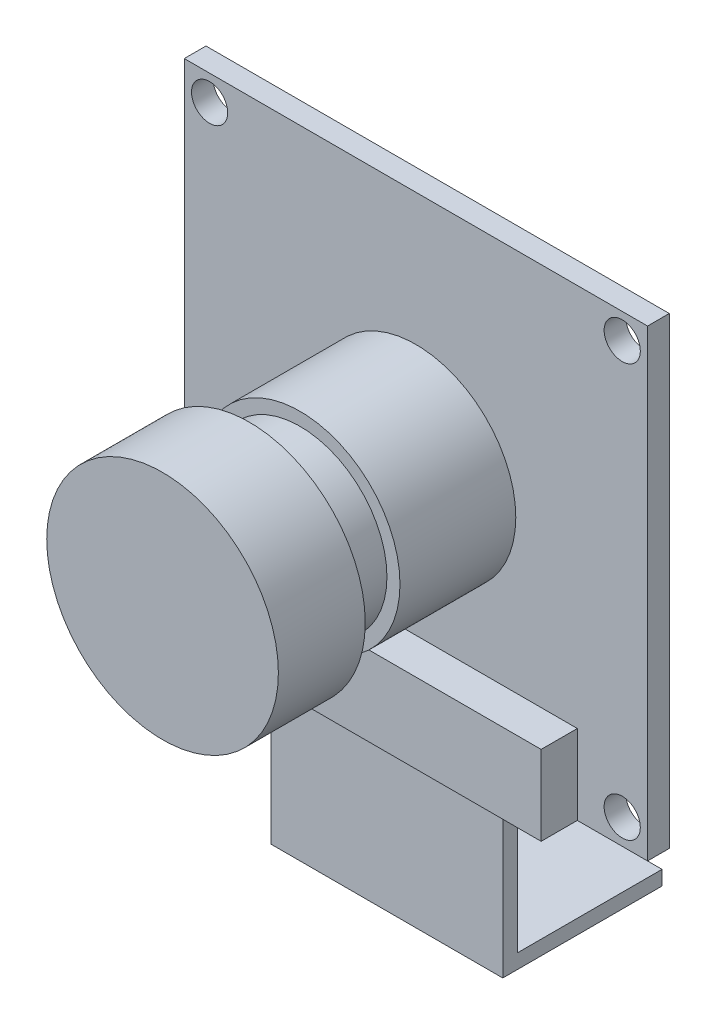
ISO-10303-21;
HEADER;
FILE_DESCRIPTION(('STEP AP214'),'2;1');
FILE_NAME('part.step','',(''),(''),'','','');
FILE_SCHEMA(('AUTOMOTIVE_DESIGN { 1 0 10303 214 1 1 1 1 }'));
ENDSEC;
DATA;
#1=APPLICATION_CONTEXT('core data for automotive mechanical design processes');
#2=APPLICATION_PROTOCOL_DEFINITION('international standard','automotive_design',2000,#1);
#3=PRODUCT_CONTEXT('',#1,'mechanical');
#4=PRODUCT('Part','Part','',(#3));
#5=PRODUCT_RELATED_PRODUCT_CATEGORY('part','',(#4));
#6=PRODUCT_DEFINITION_FORMATION('','',#4);
#7=PRODUCT_DEFINITION_CONTEXT('part definition',#1,'design');
#8=PRODUCT_DEFINITION('design','',#6,#7);
#9=PRODUCT_DEFINITION_SHAPE('','',#8);
#10=(LENGTH_UNIT() NAMED_UNIT(*) SI_UNIT(.MILLI.,.METRE.));
#11=(NAMED_UNIT(*) PLANE_ANGLE_UNIT() SI_UNIT($,.RADIAN.));
#12=(NAMED_UNIT(*) SI_UNIT($,.STERADIAN.) SOLID_ANGLE_UNIT());
#13=UNCERTAINTY_MEASURE_WITH_UNIT(LENGTH_MEASURE(1.E-05),#10,'distance_accuracy_value','');
#14=(GEOMETRIC_REPRESENTATION_CONTEXT(3) GLOBAL_UNCERTAINTY_ASSIGNED_CONTEXT((#13)) GLOBAL_UNIT_ASSIGNED_CONTEXT((#10,
#11,#12)) REPRESENTATION_CONTEXT('',''));
#15=CARTESIAN_POINT('',(0.,0.,0.));
#16=DIRECTION('',(0.,0.,1.));
#17=DIRECTION('',(1.,0.,0.));
#18=AXIS2_PLACEMENT_3D('',#15,#16,#17);
#19=CARTESIAN_POINT('',(0.,0.,1.5));
#20=DIRECTION('',(0.,0.,1.));
#21=DIRECTION('',(1.,0.,0.));
#22=AXIS2_PLACEMENT_3D('',#19,#20,#21);
#23=PLANE('',#22);
#24=CARTESIAN_POINT('',(0.,0.,1.5));
#25=DIRECTION('',(0.,0.,1.));
#26=DIRECTION('',(1.,0.,0.));
#27=AXIS2_PLACEMENT_3D('',#24,#25,#26);
#28=CIRCLE('',#27,6.9);
#29=CARTESIAN_POINT('',(6.9,0.,1.5));
#30=VERTEX_POINT('',#29);
#31=EDGE_CURVE('E228',#30,#30,#28,.T.);
#32=ORIENTED_EDGE('',*,*,#31,.F.);
#33=EDGE_LOOP('',(#32));
#34=FACE_BOUND('',#33,.T.);
#35=CARTESIAN_POINT('',(-14.25,14.25,1.5));
#36=DIRECTION('',(0.,0.,1.));
#37=DIRECTION('',(1.,0.,0.));
#38=AXIS2_PLACEMENT_3D('',#35,#36,#37);
#39=CIRCLE('',#38,1.2500000000001);
#40=CARTESIAN_POINT('',(-12.9999999999999,14.25,1.5));
#41=VERTEX_POINT('',#40);
#42=EDGE_CURVE('E281',#41,#41,#39,.T.);
#43=ORIENTED_EDGE('',*,*,#42,.F.);
#44=EDGE_LOOP('',(#43));
#45=FACE_BOUND('',#44,.T.);
#46=CARTESIAN_POINT('',(-14.25,-14.25,1.5));
#47=DIRECTION('',(0.,0.,1.));
#48=DIRECTION('',(1.,0.,0.));
#49=AXIS2_PLACEMENT_3D('',#46,#47,#48);
#50=CIRCLE('',#49,1.25000000000007);
#51=CARTESIAN_POINT('',(-12.9999999999999,-14.25,1.5));
#52=VERTEX_POINT('',#51);
#53=EDGE_CURVE('E284',#52,#52,#50,.T.);
#54=ORIENTED_EDGE('',*,*,#53,.F.);
#55=EDGE_LOOP('',(#54));
#56=FACE_BOUND('',#55,.T.);
#57=CARTESIAN_POINT('',(14.25,-14.25,1.5));
#58=DIRECTION('',(0.,0.,1.));
#59=DIRECTION('',(1.,0.,0.));
#60=AXIS2_PLACEMENT_3D('',#57,#58,#59);
#61=CIRCLE('',#60,1.25000000000003);
#62=CARTESIAN_POINT('',(15.5,-14.25,1.5));
#63=VERTEX_POINT('',#62);
#64=EDGE_CURVE('E287',#63,#63,#61,.T.);
#65=ORIENTED_EDGE('',*,*,#64,.F.);
#66=EDGE_LOOP('',(#65));
#67=FACE_BOUND('',#66,.T.);
#68=CARTESIAN_POINT('',(14.25,14.25,1.5));
#69=DIRECTION('',(0.,0.,1.));
#70=DIRECTION('',(1.,0.,0.));
#71=AXIS2_PLACEMENT_3D('',#68,#69,#70);
#72=CIRCLE('',#71,1.25);
#73=CARTESIAN_POINT('',(15.5,14.25,1.5));
#74=VERTEX_POINT('',#73);
#75=EDGE_CURVE('E290',#74,#74,#72,.T.);
#76=ORIENTED_EDGE('',*,*,#75,.F.);
#77=EDGE_LOOP('',(#76));
#78=FACE_BOUND('',#77,.T.);
#79=DIRECTION('',(1.,0.,0.));
#80=VECTOR('',#79,1.);
#81=CARTESIAN_POINT('',(0.,-16.,1.5));
#82=LINE('',#81,#80);
#83=CARTESIAN_POINT('',(-16.,-16.,1.5));
#84=VERTEX_POINT('',#83);
#85=CARTESIAN_POINT('',(-11.15,-16.,1.5));
#86=VERTEX_POINT('',#85);
#87=EDGE_CURVE('E273',#84,#86,#82,.T.);
#88=ORIENTED_EDGE('',*,*,#87,.T.);
#89=DIRECTION('',(0.,1.,0.));
#90=VECTOR('',#89,1.);
#91=CARTESIAN_POINT('',(-11.15,0.,1.5));
#92=LINE('',#91,#90);
#93=CARTESIAN_POINT('',(-11.15,-10.5,1.5));
#94=VERTEX_POINT('',#93);
#95=EDGE_CURVE('E235',#86,#94,#92,.T.);
#96=ORIENTED_EDGE('',*,*,#95,.T.);
#97=DIRECTION('',(-1.,0.,0.));
#98=VECTOR('',#97,1.);
#99=CARTESIAN_POINT('',(0.,-10.5,1.5));
#100=LINE('',#99,#98);
#101=CARTESIAN_POINT('',(11.15,-10.5,1.5));
#102=VERTEX_POINT('',#101);
#103=EDGE_CURVE('E251',#102,#94,#100,.T.);
#104=ORIENTED_EDGE('',*,*,#103,.F.);
#105=DIRECTION('',(0.,1.,0.));
#106=VECTOR('',#105,1.);
#107=CARTESIAN_POINT('',(11.15,0.,1.5));
#108=LINE('',#107,#106);
#109=CARTESIAN_POINT('',(11.15,-16.,1.5));
#110=VERTEX_POINT('',#109);
#111=EDGE_CURVE('E242',#110,#102,#108,.T.);
#112=ORIENTED_EDGE('',*,*,#111,.F.);
#113=CARTESIAN_POINT('',(16.,-16.,1.5));
#114=VERTEX_POINT('',#113);
#115=EDGE_CURVE('E271',#110,#114,#82,.T.);
#116=ORIENTED_EDGE('',*,*,#115,.T.);
#117=DIRECTION('',(0.,-1.,0.));
#118=VECTOR('',#117,1.);
#119=CARTESIAN_POINT('',(16.,0.,1.5));
#120=LINE('',#119,#118);
#121=CARTESIAN_POINT('',(16.,16.,1.5));
#122=VERTEX_POINT('',#121);
#123=EDGE_CURVE('E275',#122,#114,#120,.T.);
#124=ORIENTED_EDGE('',*,*,#123,.F.);
#125=DIRECTION('',(1.,0.,0.));
#126=VECTOR('',#125,1.);
#127=CARTESIAN_POINT('',(0.,16.,1.5));
#128=LINE('',#127,#126);
#129=CARTESIAN_POINT('',(-16.,16.,1.5));
#130=VERTEX_POINT('',#129);
#131=EDGE_CURVE('E278',#130,#122,#128,.T.);
#132=ORIENTED_EDGE('',*,*,#131,.F.);
#133=DIRECTION('',(0.,-1.,0.));
#134=VECTOR('',#133,1.);
#135=CARTESIAN_POINT('',(-16.,0.,1.5));
#136=LINE('',#135,#134);
#137=EDGE_CURVE('E268',#130,#84,#136,.T.);
#138=ORIENTED_EDGE('',*,*,#137,.T.);
#139=EDGE_LOOP('',(#88,#96,#104,#112,#116,#124,#132,#138));
#140=FACE_BOUND('',#139,.T.);
#141=ADVANCED_FACE('F55',(#34,#45,#56,#67,#78,#140),#23,.T.);
#142=CARTESIAN_POINT('',(14.25,14.25,1.5));
#143=DIRECTION('',(0.,0.,-1.));
#144=DIRECTION('',(-1.,0.,0.));
#145=AXIS2_PLACEMENT_3D('',#142,#143,#144);
#146=CYLINDRICAL_SURFACE('',#145,1.25);
#147=ORIENTED_EDGE('',*,*,#75,.T.);
#148=EDGE_LOOP('',(#147));
#149=FACE_BOUND('',#148,.T.);
#150=CARTESIAN_POINT('',(14.25,14.25,0.));
#151=DIRECTION('',(0.,0.,1.));
#152=DIRECTION('',(1.,0.,0.));
#153=AXIS2_PLACEMENT_3D('',#150,#151,#152);
#154=CIRCLE('',#153,1.25);
#155=CARTESIAN_POINT('',(15.5,14.25,0.));
#156=VERTEX_POINT('',#155);
#157=EDGE_CURVE('E272',#156,#156,#154,.T.);
#158=ORIENTED_EDGE('',*,*,#157,.F.);
#159=EDGE_LOOP('',(#158));
#160=FACE_BOUND('',#159,.T.);
#161=ADVANCED_FACE('F367',(#149,#160),#146,.F.);
#162=CARTESIAN_POINT('',(14.25,-14.25,1.5));
#163=DIRECTION('',(0.,0.,-1.));
#164=DIRECTION('',(-1.,0.,0.));
#165=AXIS2_PLACEMENT_3D('',#162,#163,#164);
#166=CYLINDRICAL_SURFACE('',#165,1.25000000000003);
#167=ORIENTED_EDGE('',*,*,#64,.T.);
#168=EDGE_LOOP('',(#167));
#169=FACE_BOUND('',#168,.T.);
#170=CARTESIAN_POINT('',(14.25,-14.25,0.));
#171=DIRECTION('',(0.,0.,1.));
#172=DIRECTION('',(1.,0.,0.));
#173=AXIS2_PLACEMENT_3D('',#170,#171,#172);
#174=CIRCLE('',#173,1.25000000000003);
#175=CARTESIAN_POINT('',(15.5,-14.25,0.));
#176=VERTEX_POINT('',#175);
#177=EDGE_CURVE('E311',#176,#176,#174,.T.);
#178=ORIENTED_EDGE('',*,*,#177,.F.);
#179=EDGE_LOOP('',(#178));
#180=FACE_BOUND('',#179,.T.);
#181=ADVANCED_FACE('F373',(#169,#180),#166,.F.);
#182=CARTESIAN_POINT('',(-14.25,-14.25,1.5));
#183=DIRECTION('',(0.,0.,-1.));
#184=DIRECTION('',(-1.,0.,0.));
#185=AXIS2_PLACEMENT_3D('',#182,#183,#184);
#186=CYLINDRICAL_SURFACE('',#185,1.25000000000007);
#187=ORIENTED_EDGE('',*,*,#53,.T.);
#188=EDGE_LOOP('',(#187));
#189=FACE_BOUND('',#188,.T.);
#190=CARTESIAN_POINT('',(-14.25,-14.25,0.));
#191=DIRECTION('',(0.,0.,1.));
#192=DIRECTION('',(1.,0.,0.));
#193=AXIS2_PLACEMENT_3D('',#190,#191,#192);
#194=CIRCLE('',#193,1.25000000000007);
#195=CARTESIAN_POINT('',(-12.9999999999999,-14.25,0.));
#196=VERTEX_POINT('',#195);
#197=EDGE_CURVE('E308',#196,#196,#194,.T.);
#198=ORIENTED_EDGE('',*,*,#197,.F.);
#199=EDGE_LOOP('',(#198));
#200=FACE_BOUND('',#199,.T.);
#201=ADVANCED_FACE('F384',(#189,#200),#186,.F.);
#202=CARTESIAN_POINT('',(-14.25,14.25,1.5));
#203=DIRECTION('',(0.,0.,-1.));
#204=DIRECTION('',(-1.,0.,0.));
#205=AXIS2_PLACEMENT_3D('',#202,#203,#204);
#206=CYLINDRICAL_SURFACE('',#205,1.2500000000001);
#207=ORIENTED_EDGE('',*,*,#42,.T.);
#208=EDGE_LOOP('',(#207));
#209=FACE_BOUND('',#208,.T.);
#210=CARTESIAN_POINT('',(-14.25,14.25,0.));
#211=DIRECTION('',(0.,0.,1.));
#212=DIRECTION('',(1.,0.,0.));
#213=AXIS2_PLACEMENT_3D('',#210,#211,#212);
#214=CIRCLE('',#213,1.2500000000001);
#215=CARTESIAN_POINT('',(-12.9999999999999,14.25,0.));
#216=VERTEX_POINT('',#215);
#217=EDGE_CURVE('E305',#216,#216,#214,.T.);
#218=ORIENTED_EDGE('',*,*,#217,.F.);
#219=EDGE_LOOP('',(#218));
#220=FACE_BOUND('',#219,.T.);
#221=ADVANCED_FACE('F388',(#209,#220),#206,.F.);
#222=CARTESIAN_POINT('',(0.,-16.,1.5));
#223=DIRECTION('',(0.,1.,0.));
#224=DIRECTION('',(0.,0.,1.));
#225=AXIS2_PLACEMENT_3D('',#222,#223,#224);
#226=PLANE('',#225);
#227=DIRECTION('',(1.,0.,0.));
#228=VECTOR('',#227,1.);
#229=CARTESIAN_POINT('',(0.,-16.,3.5));
#230=LINE('',#229,#228);
#231=CARTESIAN_POINT('',(-8.,-16.,3.5));
#232=VERTEX_POINT('',#231);
#233=CARTESIAN_POINT('',(8.,-16.,3.5));
#234=VERTEX_POINT('',#233);
#235=EDGE_CURVE('E70',#232,#234,#230,.T.);
#236=ORIENTED_EDGE('',*,*,#235,.T.);
#237=DIRECTION('',(0.,0.,-1.));
#238=VECTOR('',#237,1.);
#239=CARTESIAN_POINT('',(8.,-16.,0.));
#240=LINE('',#239,#238);
#241=CARTESIAN_POINT('',(8.,-16.,2.5));
#242=VERTEX_POINT('',#241);
#243=EDGE_CURVE('E166',#234,#242,#240,.T.);
#244=ORIENTED_EDGE('',*,*,#243,.T.);
#245=DIRECTION('',(1.,0.,0.));
#246=VECTOR('',#245,1.);
#247=CARTESIAN_POINT('',(0.,-16.,2.5));
#248=LINE('',#247,#246);
#249=CARTESIAN_POINT('',(-8.,-16.,2.5));
#250=VERTEX_POINT('',#249);
#251=EDGE_CURVE('E192',#250,#242,#248,.T.);
#252=ORIENTED_EDGE('',*,*,#251,.F.);
#253=DIRECTION('',(0.,0.,-1.));
#254=VECTOR('',#253,1.);
#255=CARTESIAN_POINT('',(-8.,-16.,0.));
#256=LINE('',#255,#254);
#257=EDGE_CURVE('E75',#232,#250,#256,.T.);
#258=ORIENTED_EDGE('',*,*,#257,.F.);
#259=EDGE_LOOP('',(#236,#244,#252,#258));
#260=FACE_BOUND('',#259,.T.);
#261=DIRECTION('',(1.,0.,0.));
#262=VECTOR('',#261,1.);
#263=CARTESIAN_POINT('',(0.,-16.,0.));
#264=LINE('',#263,#262);
#265=CARTESIAN_POINT('',(-16.,-16.,0.));
#266=VERTEX_POINT('',#265);
#267=CARTESIAN_POINT('',(16.,-16.,0.));
#268=VERTEX_POINT('',#267);
#269=EDGE_CURVE('E296',#266,#268,#264,.T.);
#270=ORIENTED_EDGE('',*,*,#269,.T.);
#271=DIRECTION('',(0.,0.,-1.));
#272=VECTOR('',#271,1.);
#273=CARTESIAN_POINT('',(16.,-16.,1.5));
#274=LINE('',#273,#272);
#275=EDGE_CURVE('E319',#114,#268,#274,.T.);
#276=ORIENTED_EDGE('',*,*,#275,.F.);
#277=ORIENTED_EDGE('',*,*,#115,.F.);
#278=DIRECTION('',(0.,0.,-1.));
#279=VECTOR('',#278,1.);
#280=CARTESIAN_POINT('',(11.15,-16.,4.));
#281=LINE('',#280,#279);
#282=CARTESIAN_POINT('',(11.15,-16.,4.));
#283=VERTEX_POINT('',#282);
#284=EDGE_CURVE('E260',#283,#110,#281,.T.);
#285=ORIENTED_EDGE('',*,*,#284,.F.);
#286=DIRECTION('',(-1.,0.,0.));
#287=VECTOR('',#286,1.);
#288=CARTESIAN_POINT('',(0.,-16.,4.));
#289=LINE('',#288,#287);
#290=CARTESIAN_POINT('',(-11.15,-16.,4.));
#291=VERTEX_POINT('',#290);
#292=EDGE_CURVE('E246',#283,#291,#289,.T.);
#293=ORIENTED_EDGE('',*,*,#292,.T.);
#294=DIRECTION('',(0.,0.,-1.));
#295=VECTOR('',#294,1.);
#296=CARTESIAN_POINT('',(-11.15,-16.,4.));
#297=LINE('',#296,#295);
#298=EDGE_CURVE('E256',#291,#86,#297,.T.);
#299=ORIENTED_EDGE('',*,*,#298,.T.);
#300=ORIENTED_EDGE('',*,*,#87,.F.);
#301=DIRECTION('',(0.,0.,-1.));
#302=VECTOR('',#301,1.);
#303=CARTESIAN_POINT('',(-16.,-16.,1.5));
#304=LINE('',#303,#302);
#305=EDGE_CURVE('E231',#84,#266,#304,.T.);
#306=ORIENTED_EDGE('',*,*,#305,.T.);
#307=EDGE_LOOP('',(#270,#276,#277,#285,#293,#299,#300,#306));
#308=FACE_BOUND('',#307,.T.);
#309=ADVANCED_FACE('F323',(#260,#308),#226,.F.);
#310=CARTESIAN_POINT('',(16.,0.,1.5));
#311=DIRECTION('',(1.,0.,0.));
#312=DIRECTION('',(0.,0.,-1.));
#313=AXIS2_PLACEMENT_3D('',#310,#311,#312);
#314=PLANE('',#313);
#315=DIRECTION('',(0.,-1.,0.));
#316=VECTOR('',#315,1.);
#317=CARTESIAN_POINT('',(16.,0.,0.));
#318=LINE('',#317,#316);
#319=CARTESIAN_POINT('',(16.,16.,0.));
#320=VERTEX_POINT('',#319);
#321=EDGE_CURVE('E299',#320,#268,#318,.T.);
#322=ORIENTED_EDGE('',*,*,#321,.F.);
#323=DIRECTION('',(0.,0.,-1.));
#324=VECTOR('',#323,1.);
#325=CARTESIAN_POINT('',(16.,16.,1.5));
#326=LINE('',#325,#324);
#327=EDGE_CURVE('E317',#122,#320,#326,.T.);
#328=ORIENTED_EDGE('',*,*,#327,.F.);
#329=ORIENTED_EDGE('',*,*,#123,.T.);
#330=ORIENTED_EDGE('',*,*,#275,.T.);
#331=EDGE_LOOP('',(#322,#328,#329,#330));
#332=FACE_BOUND('',#331,.T.);
#333=ADVANCED_FACE('F338',(#332),#314,.T.);
#334=CARTESIAN_POINT('',(0.,16.,1.5));
#335=DIRECTION('',(0.,1.,0.));
#336=DIRECTION('',(0.,0.,1.));
#337=AXIS2_PLACEMENT_3D('',#334,#335,#336);
#338=PLANE('',#337);
#339=DIRECTION('',(1.,0.,0.));
#340=VECTOR('',#339,1.);
#341=CARTESIAN_POINT('',(0.,16.,0.));
#342=LINE('',#341,#340);
#343=CARTESIAN_POINT('',(-16.,16.,0.));
#344=VERTEX_POINT('',#343);
#345=EDGE_CURVE('E302',#344,#320,#342,.T.);
#346=ORIENTED_EDGE('',*,*,#345,.F.);
#347=DIRECTION('',(0.,0.,-1.));
#348=VECTOR('',#347,1.);
#349=CARTESIAN_POINT('',(-16.,16.,1.5));
#350=LINE('',#349,#348);
#351=EDGE_CURVE('E293',#130,#344,#350,.T.);
#352=ORIENTED_EDGE('',*,*,#351,.F.);
#353=ORIENTED_EDGE('',*,*,#131,.T.);
#354=ORIENTED_EDGE('',*,*,#327,.T.);
#355=EDGE_LOOP('',(#346,#352,#353,#354));
#356=FACE_BOUND('',#355,.T.);
#357=ADVANCED_FACE('F333',(#356),#338,.T.);
#358=CARTESIAN_POINT('',(-16.,0.,1.5));
#359=DIRECTION('',(1.,0.,0.));
#360=DIRECTION('',(0.,0.,-1.));
#361=AXIS2_PLACEMENT_3D('',#358,#359,#360);
#362=PLANE('',#361);
#363=DIRECTION('',(0.,-1.,0.));
#364=VECTOR('',#363,1.);
#365=CARTESIAN_POINT('',(-16.,0.,0.));
#366=LINE('',#365,#364);
#367=EDGE_CURVE('E259',#344,#266,#366,.T.);
#368=ORIENTED_EDGE('',*,*,#367,.T.);
#369=ORIENTED_EDGE('',*,*,#305,.F.);
#370=ORIENTED_EDGE('',*,*,#137,.F.);
#371=ORIENTED_EDGE('',*,*,#351,.T.);
#372=EDGE_LOOP('',(#368,#369,#370,#371));
#373=FACE_BOUND('',#372,.T.);
#374=ADVANCED_FACE('F57',(#373),#362,.F.);
#375=CARTESIAN_POINT('',(0.,0.,0.));
#376=DIRECTION('',(0.,0.,1.));
#377=DIRECTION('',(1.,0.,0.));
#378=AXIS2_PLACEMENT_3D('',#375,#376,#377);
#379=PLANE('',#378);
#380=CARTESIAN_POINT('',(-9.50000000000001,0.,0.));
#381=DIRECTION('',(0.,0.,1.));
#382=DIRECTION('',(1.,0.,0.));
#383=AXIS2_PLACEMENT_3D('',#380,#381,#382);
#384=CIRCLE('',#383,1.5);
#385=CARTESIAN_POINT('',(-8.00000000000001,0.,0.));
#386=VERTEX_POINT('',#385);
#387=EDGE_CURVE('E12',#386,#386,#384,.F.);
#388=ORIENTED_EDGE('',*,*,#387,.F.);
#389=EDGE_LOOP('',(#388));
#390=FACE_BOUND('',#389,.T.);
#391=CARTESIAN_POINT('',(9.50000000000001,0.,0.));
#392=DIRECTION('',(0.,0.,1.));
#393=DIRECTION('',(1.,0.,0.));
#394=AXIS2_PLACEMENT_3D('',#391,#392,#393);
#395=CIRCLE('',#394,1.5);
#396=CARTESIAN_POINT('',(11.,0.,0.));
#397=VERTEX_POINT('',#396);
#398=EDGE_CURVE('E213',#397,#397,#395,.T.);
#399=ORIENTED_EDGE('',*,*,#398,.T.);
#400=EDGE_LOOP('',(#399));
#401=FACE_BOUND('',#400,.T.);
#402=ORIENTED_EDGE('',*,*,#367,.F.);
#403=ORIENTED_EDGE('',*,*,#345,.T.);
#404=ORIENTED_EDGE('',*,*,#321,.T.);
#405=ORIENTED_EDGE('',*,*,#269,.F.);
#406=EDGE_LOOP('',(#402,#403,#404,#405));
#407=FACE_BOUND('',#406,.T.);
#408=ORIENTED_EDGE('',*,*,#217,.T.);
#409=EDGE_LOOP('',(#408));
#410=FACE_BOUND('',#409,.T.);
#411=ORIENTED_EDGE('',*,*,#197,.T.);
#412=EDGE_LOOP('',(#411));
#413=FACE_BOUND('',#412,.T.);
#414=ORIENTED_EDGE('',*,*,#177,.T.);
#415=EDGE_LOOP('',(#414));
#416=FACE_BOUND('',#415,.T.);
#417=ORIENTED_EDGE('',*,*,#157,.T.);
#418=EDGE_LOOP('',(#417));
#419=FACE_BOUND('',#418,.T.);
#420=ADVANCED_FACE('F330',(#390,#401,#407,#410,#413,#416,#419),#379,.F.);
#421=CARTESIAN_POINT('',(-11.15,0.,4.));
#422=DIRECTION('',(-1.,0.,0.));
#423=DIRECTION('',(0.,0.,1.));
#424=AXIS2_PLACEMENT_3D('',#421,#422,#423);
#425=PLANE('',#424);
#426=ORIENTED_EDGE('',*,*,#95,.F.);
#427=ORIENTED_EDGE('',*,*,#298,.F.);
#428=DIRECTION('',(0.,1.,0.));
#429=VECTOR('',#428,1.);
#430=CARTESIAN_POINT('',(-11.15,0.,4.));
#431=LINE('',#430,#429);
#432=CARTESIAN_POINT('',(-11.15,-10.5,4.));
#433=VERTEX_POINT('',#432);
#434=EDGE_CURVE('E238',#291,#433,#431,.T.);
#435=ORIENTED_EDGE('',*,*,#434,.T.);
#436=DIRECTION('',(0.,0.,-1.));
#437=VECTOR('',#436,1.);
#438=CARTESIAN_POINT('',(-11.15,-10.5,4.));
#439=LINE('',#438,#437);
#440=EDGE_CURVE('E249',#433,#94,#439,.T.);
#441=ORIENTED_EDGE('',*,*,#440,.T.);
#442=EDGE_LOOP('',(#426,#427,#435,#441));
#443=FACE_BOUND('',#442,.T.);
#444=ADVANCED_FACE('F352',(#443),#425,.T.);
#445=CARTESIAN_POINT('',(11.15,0.,4.));
#446=DIRECTION('',(-1.,0.,0.));
#447=DIRECTION('',(0.,0.,1.));
#448=AXIS2_PLACEMENT_3D('',#445,#446,#447);
#449=PLANE('',#448);
#450=ORIENTED_EDGE('',*,*,#111,.T.);
#451=DIRECTION('',(0.,0.,-1.));
#452=VECTOR('',#451,1.);
#453=CARTESIAN_POINT('',(11.15,-10.5,4.));
#454=LINE('',#453,#452);
#455=CARTESIAN_POINT('',(11.15,-10.5,4.));
#456=VERTEX_POINT('',#455);
#457=EDGE_CURVE('E263',#456,#102,#454,.T.);
#458=ORIENTED_EDGE('',*,*,#457,.F.);
#459=DIRECTION('',(0.,1.,0.));
#460=VECTOR('',#459,1.);
#461=CARTESIAN_POINT('',(11.15,0.,4.));
#462=LINE('',#461,#460);
#463=EDGE_CURVE('E244',#283,#456,#462,.T.);
#464=ORIENTED_EDGE('',*,*,#463,.F.);
#465=ORIENTED_EDGE('',*,*,#284,.T.);
#466=EDGE_LOOP('',(#450,#458,#464,#465));
#467=FACE_BOUND('',#466,.T.);
#468=ADVANCED_FACE('F343',(#467),#449,.F.);
#469=CARTESIAN_POINT('',(0.,-10.5,4.));
#470=DIRECTION('',(0.,-1.,0.));
#471=DIRECTION('',(0.,0.,-1.));
#472=AXIS2_PLACEMENT_3D('',#469,#470,#471);
#473=PLANE('',#472);
#474=ORIENTED_EDGE('',*,*,#103,.T.);
#475=ORIENTED_EDGE('',*,*,#440,.F.);
#476=DIRECTION('',(-1.,0.,0.));
#477=VECTOR('',#476,1.);
#478=CARTESIAN_POINT('',(0.,-10.5,4.));
#479=LINE('',#478,#477);
#480=EDGE_CURVE('E241',#456,#433,#479,.T.);
#481=ORIENTED_EDGE('',*,*,#480,.F.);
#482=ORIENTED_EDGE('',*,*,#457,.T.);
#483=EDGE_LOOP('',(#474,#475,#481,#482));
#484=FACE_BOUND('',#483,.T.);
#485=ADVANCED_FACE('F355',(#484),#473,.F.);
#486=CARTESIAN_POINT('',(0.,0.,4.));
#487=DIRECTION('',(0.,0.,1.));
#488=DIRECTION('',(1.,0.,0.));
#489=AXIS2_PLACEMENT_3D('',#486,#487,#488);
#490=PLANE('',#489);
#491=ORIENTED_EDGE('',*,*,#434,.F.);
#492=ORIENTED_EDGE('',*,*,#292,.F.);
#493=ORIENTED_EDGE('',*,*,#463,.T.);
#494=ORIENTED_EDGE('',*,*,#480,.T.);
#495=EDGE_LOOP('',(#491,#492,#493,#494));
#496=FACE_BOUND('',#495,.T.);
#497=ADVANCED_FACE('F349',(#496),#490,.T.);
#498=CARTESIAN_POINT('',(0.,0.,9.5));
#499=DIRECTION('',(0.,0.,-1.));
#500=DIRECTION('',(-1.,0.,0.));
#501=AXIS2_PLACEMENT_3D('',#498,#499,#500);
#502=CYLINDRICAL_SURFACE('',#501,6.9);
#503=CARTESIAN_POINT('',(0.,0.,9.5));
#504=DIRECTION('',(0.,0.,1.));
#505=DIRECTION('',(1.,0.,0.));
#506=AXIS2_PLACEMENT_3D('',#503,#504,#505);
#507=CIRCLE('',#506,6.9);
#508=CARTESIAN_POINT('',(6.9,0.,9.5));
#509=VERTEX_POINT('',#508);
#510=EDGE_CURVE('E232',#509,#509,#507,.T.);
#511=ORIENTED_EDGE('',*,*,#510,.F.);
#512=EDGE_LOOP('',(#511));
#513=FACE_BOUND('',#512,.T.);
#514=ORIENTED_EDGE('',*,*,#31,.T.);
#515=EDGE_LOOP('',(#514));
#516=FACE_BOUND('',#515,.T.);
#517=ADVANCED_FACE('F362',(#513,#516),#502,.T.);
#518=CARTESIAN_POINT('',(0.,0.,9.5));
#519=DIRECTION('',(0.,0.,1.));
#520=DIRECTION('',(1.,0.,0.));
#521=AXIS2_PLACEMENT_3D('',#518,#519,#520);
#522=PLANE('',#521);
#523=CARTESIAN_POINT('',(0.,0.,9.5));
#524=DIRECTION('',(0.,0.,1.));
#525=DIRECTION('',(1.,0.,0.));
#526=AXIS2_PLACEMENT_3D('',#523,#524,#525);
#527=CIRCLE('',#526,6.);
#528=CARTESIAN_POINT('',(6.,0.,9.5));
#529=VERTEX_POINT('',#528);
#530=EDGE_CURVE('E63',#529,#529,#527,.T.);
#531=ORIENTED_EDGE('',*,*,#530,.F.);
#532=EDGE_LOOP('',(#531));
#533=FACE_BOUND('',#532,.T.);
#534=ORIENTED_EDGE('',*,*,#510,.T.);
#535=EDGE_LOOP('',(#534));
#536=FACE_BOUND('',#535,.T.);
#537=ADVANCED_FACE('F459',(#533,#536),#522,.T.);
#538=CARTESIAN_POINT('',(0.,0.,13.));
#539=DIRECTION('',(0.,0.,-1.));
#540=DIRECTION('',(-1.,0.,0.));
#541=AXIS2_PLACEMENT_3D('',#538,#539,#540);
#542=CYLINDRICAL_SURFACE('',#541,6.);
#543=CARTESIAN_POINT('',(0.,0.,13.));
#544=DIRECTION('',(0.,0.,1.));
#545=DIRECTION('',(1.,0.,0.));
#546=AXIS2_PLACEMENT_3D('',#543,#544,#545);
#547=CIRCLE('',#546,6.);
#548=CARTESIAN_POINT('',(6.,0.,13.));
#549=VERTEX_POINT('',#548);
#550=EDGE_CURVE('E223',#549,#549,#547,.T.);
#551=ORIENTED_EDGE('',*,*,#550,.F.);
#552=EDGE_LOOP('',(#551));
#553=FACE_BOUND('',#552,.T.);
#554=ORIENTED_EDGE('',*,*,#530,.T.);
#555=EDGE_LOOP('',(#554));
#556=FACE_BOUND('',#555,.T.);
#557=ADVANCED_FACE('F470',(#553,#556),#542,.T.);
#558=CARTESIAN_POINT('',(0.,0.,19.));
#559=DIRECTION('',(0.,0.,-1.));
#560=DIRECTION('',(-1.,0.,0.));
#561=AXIS2_PLACEMENT_3D('',#558,#559,#560);
#562=CYLINDRICAL_SURFACE('',#561,8.);
#563=CARTESIAN_POINT('',(0.,0.,19.));
#564=DIRECTION('',(0.,0.,1.));
#565=DIRECTION('',(1.,0.,0.));
#566=AXIS2_PLACEMENT_3D('',#563,#564,#565);
#567=CIRCLE('',#566,8.);
#568=CARTESIAN_POINT('',(7.99999999999999,0.,19.));
#569=VERTEX_POINT('',#568);
#570=EDGE_CURVE('E220',#569,#569,#567,.T.);
#571=ORIENTED_EDGE('',*,*,#570,.F.);
#572=EDGE_LOOP('',(#571));
#573=FACE_BOUND('',#572,.T.);
#574=CARTESIAN_POINT('',(0.,0.,13.));
#575=DIRECTION('',(0.,0.,1.));
#576=DIRECTION('',(1.,0.,0.));
#577=AXIS2_PLACEMENT_3D('',#574,#575,#576);
#578=CIRCLE('',#577,8.);
#579=CARTESIAN_POINT('',(7.99999999999999,0.,13.));
#580=VERTEX_POINT('',#579);
#581=EDGE_CURVE('E217',#580,#580,#578,.T.);
#582=ORIENTED_EDGE('',*,*,#581,.T.);
#583=EDGE_LOOP('',(#582));
#584=FACE_BOUND('',#583,.T.);
#585=ADVANCED_FACE('F481',(#573,#584),#562,.T.);
#586=CARTESIAN_POINT('',(0.,0.,19.));
#587=DIRECTION('',(0.,0.,1.));
#588=DIRECTION('',(1.,0.,0.));
#589=AXIS2_PLACEMENT_3D('',#586,#587,#588);
#590=PLANE('',#589);
#591=ORIENTED_EDGE('',*,*,#570,.T.);
#592=EDGE_LOOP('',(#591));
#593=FACE_BOUND('',#592,.T.);
#594=ADVANCED_FACE('F492',(#593),#590,.T.);
#595=CARTESIAN_POINT('',(0.,0.,13.));
#596=DIRECTION('',(0.,0.,1.));
#597=DIRECTION('',(1.,0.,0.));
#598=AXIS2_PLACEMENT_3D('',#595,#596,#597);
#599=PLANE('',#598);
#600=ORIENTED_EDGE('',*,*,#550,.T.);
#601=EDGE_LOOP('',(#600));
#602=FACE_BOUND('',#601,.T.);
#603=ORIENTED_EDGE('',*,*,#581,.F.);
#604=EDGE_LOOP('',(#603));
#605=FACE_BOUND('',#604,.T.);
#606=ADVANCED_FACE('F503',(#602,#605),#599,.F.);
#607=CARTESIAN_POINT('',(9.50000000000001,0.,-0.5));
#608=DIRECTION('',(0.,0.,1.));
#609=DIRECTION('',(1.,0.,0.));
#610=AXIS2_PLACEMENT_3D('',#607,#608,#609);
#611=CYLINDRICAL_SURFACE('',#610,1.5);
#612=CARTESIAN_POINT('',(9.50000000000001,0.,-0.5));
#613=DIRECTION('',(0.,0.,1.));
#614=DIRECTION('',(1.,0.,0.));
#615=AXIS2_PLACEMENT_3D('',#612,#613,#614);
#616=CIRCLE('',#615,1.5);
#617=CARTESIAN_POINT('',(11.,0.,-0.5));
#618=VERTEX_POINT('',#617);
#619=EDGE_CURVE('E214',#618,#618,#616,.T.);
#620=ORIENTED_EDGE('',*,*,#619,.T.);
#621=EDGE_LOOP('',(#620));
#622=FACE_BOUND('',#621,.T.);
#623=ORIENTED_EDGE('',*,*,#398,.F.);
#624=EDGE_LOOP('',(#623));
#625=FACE_BOUND('',#624,.T.);
#626=ADVANCED_FACE('F512',(#622,#625),#611,.T.);
#627=CARTESIAN_POINT('',(0.,0.,-0.5));
#628=DIRECTION('',(0.,0.,1.));
#629=DIRECTION('',(1.,0.,0.));
#630=AXIS2_PLACEMENT_3D('',#627,#628,#629);
#631=PLANE('',#630);
#632=ORIENTED_EDGE('',*,*,#619,.F.);
#633=EDGE_LOOP('',(#632));
#634=FACE_BOUND('',#633,.T.);
#635=ADVANCED_FACE('F529',(#634),#631,.F.);
#636=CARTESIAN_POINT('',(-9.50000000000001,0.,-0.5));
#637=DIRECTION('',(0.,0.,1.));
#638=DIRECTION('',(1.,0.,0.));
#639=AXIS2_PLACEMENT_3D('',#636,#637,#638);
#640=CYLINDRICAL_SURFACE('',#639,1.5);
#641=CARTESIAN_POINT('',(-9.50000000000001,0.,-0.5));
#642=DIRECTION('',(0.,0.,1.));
#643=DIRECTION('',(1.,0.,0.));
#644=AXIS2_PLACEMENT_3D('',#641,#642,#643);
#645=CIRCLE('',#644,1.5);
#646=CARTESIAN_POINT('',(-8.00000000000001,0.,-0.5));
#647=VERTEX_POINT('',#646);
#648=EDGE_CURVE('E210',#647,#647,#645,.F.);
#649=ORIENTED_EDGE('',*,*,#648,.F.);
#650=EDGE_LOOP('',(#649));
#651=FACE_BOUND('',#650,.T.);
#652=ORIENTED_EDGE('',*,*,#387,.T.);
#653=EDGE_LOOP('',(#652));
#654=FACE_BOUND('',#653,.T.);
#655=ADVANCED_FACE('F540',(#651,#654),#640,.T.);
#656=CARTESIAN_POINT('',(0.,0.,-0.5));
#657=DIRECTION('',(0.,0.,1.));
#658=DIRECTION('',(1.,0.,0.));
#659=AXIS2_PLACEMENT_3D('',#656,#657,#658);
#660=PLANE('',#659);
#661=ORIENTED_EDGE('',*,*,#648,.T.);
#662=EDGE_LOOP('',(#661));
#663=FACE_BOUND('',#662,.T.);
#664=ADVANCED_FACE('F551',(#663),#660,.F.);
#665=CARTESIAN_POINT('',(8.,-26.,0.));
#666=DIRECTION('',(1.,0.,0.));
#667=DIRECTION('',(0.,0.,-1.));
#668=AXIS2_PLACEMENT_3D('',#665,#666,#667);
#669=PLANE('',#668);
#670=ORIENTED_EDGE('',*,*,#243,.F.);
#671=DIRECTION('',(0.,1.,0.));
#672=VECTOR('',#671,1.);
#673=CARTESIAN_POINT('',(8.,-26.,3.5));
#674=LINE('',#673,#672);
#675=CARTESIAN_POINT('',(8.,-26.,3.5));
#676=VERTEX_POINT('',#675);
#677=EDGE_CURVE('E208',#676,#234,#674,.T.);
#678=ORIENTED_EDGE('',*,*,#677,.F.);
#679=DIRECTION('',(0.,0.,-1.));
#680=VECTOR('',#679,1.);
#681=CARTESIAN_POINT('',(8.,-26.,0.));
#682=LINE('',#681,#680);
#683=CARTESIAN_POINT('',(8.,-26.,-7.5));
#684=VERTEX_POINT('',#683);
#685=EDGE_CURVE('E174',#676,#684,#682,.T.);
#686=ORIENTED_EDGE('',*,*,#685,.T.);
#687=DIRECTION('',(0.,-1.,0.));
#688=VECTOR('',#687,1.);
#689=CARTESIAN_POINT('',(8.,0.,-7.5));
#690=LINE('',#689,#688);
#691=CARTESIAN_POINT('',(8.,-25.,-7.5));
#692=VERTEX_POINT('',#691);
#693=EDGE_CURVE('E170',#692,#684,#690,.T.);
#694=ORIENTED_EDGE('',*,*,#693,.F.);
#695=DIRECTION('',(0.,0.,1.));
#696=VECTOR('',#695,1.);
#697=CARTESIAN_POINT('',(8.,-25.,-7.5));
#698=LINE('',#697,#696);
#699=CARTESIAN_POINT('',(8.,-25.,2.5));
#700=VERTEX_POINT('',#699);
#701=EDGE_CURVE('E157',#692,#700,#698,.T.);
#702=ORIENTED_EDGE('',*,*,#701,.T.);
#703=DIRECTION('',(0.,1.,0.));
#704=VECTOR('',#703,1.);
#705=CARTESIAN_POINT('',(8.,-26.,2.5));
#706=LINE('',#705,#704);
#707=EDGE_CURVE('E197',#700,#242,#706,.T.);
#708=ORIENTED_EDGE('',*,*,#707,.T.);
#709=EDGE_LOOP('',(#670,#678,#686,#694,#702,#708));
#710=FACE_BOUND('',#709,.T.);
#711=ADVANCED_FACE('F172',(#710),#669,.T.);
#712=CARTESIAN_POINT('',(0.,-26.,3.5));
#713=DIRECTION('',(0.,0.,1.));
#714=DIRECTION('',(1.,0.,0.));
#715=AXIS2_PLACEMENT_3D('',#712,#713,#714);
#716=PLANE('',#715);
#717=ORIENTED_EDGE('',*,*,#235,.F.);
#718=DIRECTION('',(0.,1.,0.));
#719=VECTOR('',#718,1.);
#720=CARTESIAN_POINT('',(-8.,-26.,3.5));
#721=LINE('',#720,#719);
#722=CARTESIAN_POINT('',(-8.,-26.,3.5));
#723=VERTEX_POINT('',#722);
#724=EDGE_CURVE('E206',#723,#232,#721,.T.);
#725=ORIENTED_EDGE('',*,*,#724,.F.);
#726=DIRECTION('',(1.,0.,0.));
#727=VECTOR('',#726,1.);
#728=CARTESIAN_POINT('',(0.,-26.,3.5));
#729=LINE('',#728,#727);
#730=EDGE_CURVE('E191',#723,#676,#729,.T.);
#731=ORIENTED_EDGE('',*,*,#730,.T.);
#732=ORIENTED_EDGE('',*,*,#677,.T.);
#733=EDGE_LOOP('',(#717,#725,#731,#732));
#734=FACE_BOUND('',#733,.T.);
#735=ADVANCED_FACE('F571',(#734),#716,.T.);
#736=CARTESIAN_POINT('',(-8.,-26.,0.));
#737=DIRECTION('',(1.,0.,0.));
#738=DIRECTION('',(0.,0.,-1.));
#739=AXIS2_PLACEMENT_3D('',#736,#737,#738);
#740=PLANE('',#739);
#741=ORIENTED_EDGE('',*,*,#257,.T.);
#742=DIRECTION('',(0.,1.,0.));
#743=VECTOR('',#742,1.);
#744=CARTESIAN_POINT('',(-8.,-26.,2.5));
#745=LINE('',#744,#743);
#746=CARTESIAN_POINT('',(-8.,-25.,2.5));
#747=VERTEX_POINT('',#746);
#748=EDGE_CURVE('E204',#747,#250,#745,.T.);
#749=ORIENTED_EDGE('',*,*,#748,.F.);
#750=DIRECTION('',(0.,0.,1.));
#751=VECTOR('',#750,1.);
#752=CARTESIAN_POINT('',(-8.,-25.,-7.5));
#753=LINE('',#752,#751);
#754=CARTESIAN_POINT('',(-8.,-25.,-7.5));
#755=VERTEX_POINT('',#754);
#756=EDGE_CURVE('E167',#755,#747,#753,.T.);
#757=ORIENTED_EDGE('',*,*,#756,.F.);
#758=DIRECTION('',(0.,1.,0.));
#759=VECTOR('',#758,1.);
#760=CARTESIAN_POINT('',(-8.,0.,-7.5));
#761=LINE('',#760,#759);
#762=CARTESIAN_POINT('',(-8.,-26.,-7.5));
#763=VERTEX_POINT('',#762);
#764=EDGE_CURVE('E182',#763,#755,#761,.T.);
#765=ORIENTED_EDGE('',*,*,#764,.F.);
#766=DIRECTION('',(0.,0.,-1.));
#767=VECTOR('',#766,1.);
#768=CARTESIAN_POINT('',(-8.,-26.,0.));
#769=LINE('',#768,#767);
#770=EDGE_CURVE('E195',#723,#763,#769,.T.);
#771=ORIENTED_EDGE('',*,*,#770,.F.);
#772=ORIENTED_EDGE('',*,*,#724,.T.);
#773=EDGE_LOOP('',(#741,#749,#757,#765,#771,#772));
#774=FACE_BOUND('',#773,.T.);
#775=ADVANCED_FACE('F576',(#774),#740,.F.);
#776=CARTESIAN_POINT('',(0.,-26.,2.5));
#777=DIRECTION('',(0.,0.,1.));
#778=DIRECTION('',(1.,0.,0.));
#779=AXIS2_PLACEMENT_3D('',#776,#777,#778);
#780=PLANE('',#779);
#781=ORIENTED_EDGE('',*,*,#707,.F.);
#782=DIRECTION('',(-1.,0.,0.));
#783=VECTOR('',#782,1.);
#784=CARTESIAN_POINT('',(0.,-25.,2.5));
#785=LINE('',#784,#783);
#786=EDGE_CURVE('E163',#700,#747,#785,.T.);
#787=ORIENTED_EDGE('',*,*,#786,.T.);
#788=ORIENTED_EDGE('',*,*,#748,.T.);
#789=ORIENTED_EDGE('',*,*,#251,.T.);
#790=EDGE_LOOP('',(#781,#787,#788,#789));
#791=FACE_BOUND('',#790,.T.);
#792=ADVANCED_FACE('F597',(#791),#780,.F.);
#793=CARTESIAN_POINT('',(0.,-26.,0.));
#794=DIRECTION('',(0.,-1.,0.));
#795=DIRECTION('',(0.,0.,-1.));
#796=AXIS2_PLACEMENT_3D('',#793,#794,#795);
#797=PLANE('',#796);
#798=ORIENTED_EDGE('',*,*,#685,.F.);
#799=ORIENTED_EDGE('',*,*,#730,.F.);
#800=ORIENTED_EDGE('',*,*,#770,.T.);
#801=DIRECTION('',(-1.,0.,0.));
#802=VECTOR('',#801,1.);
#803=CARTESIAN_POINT('',(0.,-26.,-7.5));
#804=LINE('',#803,#802);
#805=EDGE_CURVE('E178',#684,#763,#804,.T.);
#806=ORIENTED_EDGE('',*,*,#805,.F.);
#807=EDGE_LOOP('',(#798,#799,#800,#806));
#808=FACE_BOUND('',#807,.T.);
#809=ADVANCED_FACE('F608',(#808),#797,.T.);
#810=CARTESIAN_POINT('',(0.,-25.,-7.5));
#811=DIRECTION('',(0.,1.,0.));
#812=DIRECTION('',(0.,0.,1.));
#813=AXIS2_PLACEMENT_3D('',#810,#811,#812);
#814=PLANE('',#813);
#815=ORIENTED_EDGE('',*,*,#786,.F.);
#816=ORIENTED_EDGE('',*,*,#701,.F.);
#817=DIRECTION('',(-1.,0.,0.));
#818=VECTOR('',#817,1.);
#819=CARTESIAN_POINT('',(0.,-25.,-7.5));
#820=LINE('',#819,#818);
#821=EDGE_CURVE('E161',#692,#755,#820,.T.);
#822=ORIENTED_EDGE('',*,*,#821,.T.);
#823=ORIENTED_EDGE('',*,*,#756,.T.);
#824=EDGE_LOOP('',(#815,#816,#822,#823));
#825=FACE_BOUND('',#824,.T.);
#826=ADVANCED_FACE('F159',(#825),#814,.T.);
#827=CARTESIAN_POINT('',(0.,0.,-7.5));
#828=DIRECTION('',(0.,0.,-1.));
#829=DIRECTION('',(-1.,0.,0.));
#830=AXIS2_PLACEMENT_3D('',#827,#828,#829);
#831=PLANE('',#830);
#832=ORIENTED_EDGE('',*,*,#821,.F.);
#833=ORIENTED_EDGE('',*,*,#693,.T.);
#834=ORIENTED_EDGE('',*,*,#805,.T.);
#835=ORIENTED_EDGE('',*,*,#764,.T.);
#836=EDGE_LOOP('',(#832,#833,#834,#835));
#837=FACE_BOUND('',#836,.T.);
#838=ADVANCED_FACE('F180',(#837),#831,.T.);
#839=CLOSED_SHELL('',(#141,#161,#181,#201,#221,#309,#333,#357,#374,#420,#444,#468,#485,#497,
#517,#537,#557,#585,#594,#606,#626,#635,#655,#664,#711,#735,#775,#792,#809,#826,#838));
#840=MANIFOLD_SOLID_BREP('B2',#839);
#841=ADVANCED_BREP_SHAPE_REPRESENTATION('',(#18,#840),#14);
#842=SHAPE_DEFINITION_REPRESENTATION(#9,#841);
ENDSEC;
END-ISO-10303-21;
